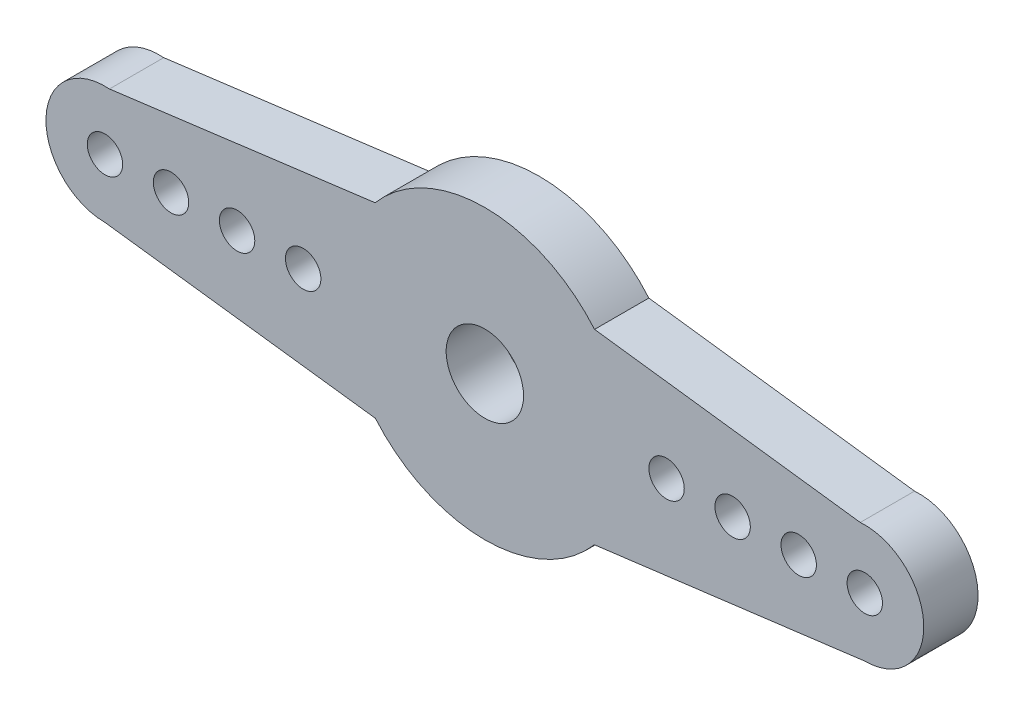
ISO-10303-21;
HEADER;
FILE_DESCRIPTION(('STEP AP214'),'2;1');
FILE_NAME('part.step','',(''),(''),'','','');
FILE_SCHEMA(('AUTOMOTIVE_DESIGN { 1 0 10303 214 1 1 1 1 }'));
ENDSEC;
DATA;
#1=APPLICATION_CONTEXT('core data for automotive mechanical design processes');
#2=APPLICATION_PROTOCOL_DEFINITION('international standard','automotive_design',2000,#1);
#3=PRODUCT_CONTEXT('',#1,'mechanical');
#4=PRODUCT('Part','Part','',(#3));
#5=PRODUCT_RELATED_PRODUCT_CATEGORY('part','',(#4));
#6=PRODUCT_DEFINITION_FORMATION('','',#4);
#7=PRODUCT_DEFINITION_CONTEXT('part definition',#1,'design');
#8=PRODUCT_DEFINITION('design','',#6,#7);
#9=PRODUCT_DEFINITION_SHAPE('','',#8);
#10=(LENGTH_UNIT() NAMED_UNIT(*) SI_UNIT(.MILLI.,.METRE.));
#11=(NAMED_UNIT(*) PLANE_ANGLE_UNIT() SI_UNIT($,.RADIAN.));
#12=(NAMED_UNIT(*) SI_UNIT($,.STERADIAN.) SOLID_ANGLE_UNIT());
#13=UNCERTAINTY_MEASURE_WITH_UNIT(LENGTH_MEASURE(1.E-05),#10,'distance_accuracy_value','');
#14=(GEOMETRIC_REPRESENTATION_CONTEXT(3) GLOBAL_UNCERTAINTY_ASSIGNED_CONTEXT((#13)) GLOBAL_UNIT_ASSIGNED_CONTEXT((#10,
#11,#12)) REPRESENTATION_CONTEXT('',''));
#15=CARTESIAN_POINT('',(0.,0.,0.));
#16=DIRECTION('',(0.,0.,1.));
#17=DIRECTION('',(1.,0.,0.));
#18=AXIS2_PLACEMENT_3D('',#15,#16,#17);
#19=CARTESIAN_POINT('',(0.,0.,2.3));
#20=DIRECTION('',(0.,0.,-1.));
#21=DIRECTION('',(-1.,0.,0.));
#22=AXIS2_PLACEMENT_3D('',#19,#20,#21);
#23=CYLINDRICAL_SURFACE('',#22,6.1);
#24=CARTESIAN_POINT('',(0.,0.,0.));
#25=DIRECTION('',(0.,0.,1.));
#26=DIRECTION('',(1.,0.,0.));
#27=AXIS2_PLACEMENT_3D('',#24,#25,#26);
#28=CIRCLE('',#27,6.1);
#29=CARTESIAN_POINT('',(-4.64050892734946,-3.95925206259844,0.));
#30=VERTEX_POINT('',#29);
#31=CARTESIAN_POINT('',(4.64050892734946,-3.95925206259844,0.));
#32=VERTEX_POINT('',#31);
#33=EDGE_CURVE('E158',#30,#32,#28,.T.);
#34=ORIENTED_EDGE('',*,*,#33,.T.);
#35=DIRECTION('',(0.,0.,-1.));
#36=VECTOR('',#35,1.);
#37=CARTESIAN_POINT('',(4.64050892734946,-3.95925206259844,2.3));
#38=LINE('',#37,#36);
#39=CARTESIAN_POINT('',(4.64050892734946,-3.95925206259844,2.3));
#40=VERTEX_POINT('',#39);
#41=EDGE_CURVE('E11',#40,#32,#38,.T.);
#42=ORIENTED_EDGE('',*,*,#41,.F.);
#43=CARTESIAN_POINT('',(0.,0.,2.3));
#44=DIRECTION('',(0.,0.,1.));
#45=DIRECTION('',(1.,0.,0.));
#46=AXIS2_PLACEMENT_3D('',#43,#44,#45);
#47=CIRCLE('',#46,6.1);
#48=CARTESIAN_POINT('',(-4.64050892734946,-3.95925206259844,2.3));
#49=VERTEX_POINT('',#48);
#50=EDGE_CURVE('E203',#49,#40,#47,.T.);
#51=ORIENTED_EDGE('',*,*,#50,.F.);
#52=DIRECTION('',(0.,0.,-1.));
#53=VECTOR('',#52,1.);
#54=CARTESIAN_POINT('',(-4.64050892734946,-3.95925206259844,2.3));
#55=LINE('',#54,#53);
#56=EDGE_CURVE('E48',#49,#30,#55,.T.);
#57=ORIENTED_EDGE('',*,*,#56,.T.);
#58=EDGE_LOOP('',(#34,#42,#51,#57));
#59=FACE_BOUND('',#58,.T.);
#60=ADVANCED_FACE('F32',(#59),#23,.T.);
#61=CARTESIAN_POINT('',(0.569988751723824,-4.47743906224629,2.3));
#62=DIRECTION('',(-0.126283248481219,0.991994224354674,0.));
#63=DIRECTION('',(-0.991994224354674,-0.126283248481219,0.));
#64=AXIS2_PLACEMENT_3D('',#61,#62,#63);
#65=PLANE('',#64);
#66=DIRECTION('',(0.991994224354674,0.126283248481219,0.));
#67=VECTOR('',#66,1.);
#68=CARTESIAN_POINT('',(0.569988751723824,-4.47743906224629,0.));
#69=LINE('',#68,#67);
#70=CARTESIAN_POINT('',(16.1,-2.50043131236952,0.));
#71=VERTEX_POINT('',#70);
#72=EDGE_CURVE('E160',#32,#71,#69,.T.);
#73=ORIENTED_EDGE('',*,*,#72,.T.);
#74=DIRECTION('',(0.,0.,-1.));
#75=VECTOR('',#74,1.);
#76=CARTESIAN_POINT('',(16.1,-2.50043131236952,2.3));
#77=LINE('',#76,#75);
#78=CARTESIAN_POINT('',(16.1,-2.50043131236952,2.3));
#79=VERTEX_POINT('',#78);
#80=EDGE_CURVE('E40',#79,#71,#77,.T.);
#81=ORIENTED_EDGE('',*,*,#80,.F.);
#82=DIRECTION('',(0.991994224354674,0.126283248481219,0.));
#83=VECTOR('',#82,1.);
#84=CARTESIAN_POINT('',(0.569988751723824,-4.47743906224629,2.3));
#85=LINE('',#84,#83);
#86=EDGE_CURVE('E86',#40,#79,#85,.T.);
#87=ORIENTED_EDGE('',*,*,#86,.F.);
#88=ORIENTED_EDGE('',*,*,#41,.T.);
#89=EDGE_LOOP('',(#73,#81,#87,#88));
#90=FACE_BOUND('',#89,.T.);
#91=ADVANCED_FACE('F231',(#90),#65,.F.);
#92=CARTESIAN_POINT('',(16.1,0.,2.3));
#93=DIRECTION('',(0.,0.,-1.));
#94=DIRECTION('',(-1.,0.,0.));
#95=AXIS2_PLACEMENT_3D('',#92,#93,#94);
#96=CYLINDRICAL_SURFACE('',#95,2.50043131236952);
#97=CARTESIAN_POINT('',(16.1,0.,0.));
#98=DIRECTION('',(0.,0.,1.));
#99=DIRECTION('',(1.,0.,0.));
#100=AXIS2_PLACEMENT_3D('',#97,#98,#99);
#101=CIRCLE('',#100,2.50043131236952);
#102=CARTESIAN_POINT('',(15.9091604900332,2.49313798842215,0.));
#103=VERTEX_POINT('',#102);
#104=EDGE_CURVE('E162',#71,#103,#101,.T.);
#105=ORIENTED_EDGE('',*,*,#104,.T.);
#106=DIRECTION('',(0.,0.,-1.));
#107=VECTOR('',#106,1.);
#108=CARTESIAN_POINT('',(15.9091604900332,2.49313798842215,2.3));
#109=LINE('',#108,#107);
#110=CARTESIAN_POINT('',(15.9091604900332,2.49313798842215,2.3));
#111=VERTEX_POINT('',#110);
#112=EDGE_CURVE('E209',#111,#103,#109,.T.);
#113=ORIENTED_EDGE('',*,*,#112,.F.);
#114=CARTESIAN_POINT('',(16.1,0.,2.3));
#115=DIRECTION('',(0.,0.,1.));
#116=DIRECTION('',(1.,0.,0.));
#117=AXIS2_PLACEMENT_3D('',#114,#115,#116);
#118=CIRCLE('',#117,2.50043131236952);
#119=EDGE_CURVE('E216',#79,#111,#118,.T.);
#120=ORIENTED_EDGE('',*,*,#119,.F.);
#121=ORIENTED_EDGE('',*,*,#80,.T.);
#122=EDGE_LOOP('',(#105,#113,#120,#121));
#123=FACE_BOUND('',#122,.T.);
#124=ADVANCED_FACE('F214',(#123),#96,.T.);
#125=CARTESIAN_POINT('',(0.578588643787063,4.47519548706033,2.3));
#126=DIRECTION('',(0.128220717103098,0.991745656761635,0.));
#127=DIRECTION('',(-0.991745656761635,0.128220717103098,0.));
#128=AXIS2_PLACEMENT_3D('',#125,#126,#127);
#129=PLANE('',#128);
#130=DIRECTION('',(0.991745656761635,-0.128220717103098,0.));
#131=VECTOR('',#130,1.);
#132=CARTESIAN_POINT('',(0.578588643787063,4.47519548706033,0.));
#133=LINE('',#132,#131);
#134=CARTESIAN_POINT('',(4.64932228794987,3.94889886712392,0.));
#135=VERTEX_POINT('',#134);
#136=EDGE_CURVE('E165',#135,#103,#133,.T.);
#137=ORIENTED_EDGE('',*,*,#136,.F.);
#138=DIRECTION('',(0.,0.,-1.));
#139=VECTOR('',#138,1.);
#140=CARTESIAN_POINT('',(4.64932228794987,3.94889886712392,2.3));
#141=LINE('',#140,#139);
#142=CARTESIAN_POINT('',(4.64932228794987,3.94889886712392,2.3));
#143=VERTEX_POINT('',#142);
#144=EDGE_CURVE('E207',#143,#135,#141,.T.);
#145=ORIENTED_EDGE('',*,*,#144,.F.);
#146=DIRECTION('',(0.991745656761635,-0.128220717103098,0.));
#147=VECTOR('',#146,1.);
#148=CARTESIAN_POINT('',(0.578588643787063,4.47519548706033,2.3));
#149=LINE('',#148,#147);
#150=EDGE_CURVE('E225',#143,#111,#149,.T.);
#151=ORIENTED_EDGE('',*,*,#150,.T.);
#152=ORIENTED_EDGE('',*,*,#112,.T.);
#153=EDGE_LOOP('',(#137,#145,#151,#152));
#154=FACE_BOUND('',#153,.T.);
#155=ADVANCED_FACE('F223',(#154),#129,.T.);
#156=CARTESIAN_POINT('',(0.,0.,2.3));
#157=DIRECTION('',(0.,0.,-1.));
#158=DIRECTION('',(-1.,0.,0.));
#159=AXIS2_PLACEMENT_3D('',#156,#157,#158);
#160=CYLINDRICAL_SURFACE('',#159,6.1);
#161=CARTESIAN_POINT('',(0.,0.,0.));
#162=DIRECTION('',(0.,0.,1.));
#163=DIRECTION('',(1.,0.,0.));
#164=AXIS2_PLACEMENT_3D('',#161,#162,#163);
#165=CIRCLE('',#164,6.1);
#166=CARTESIAN_POINT('',(-4.64932228794987,3.94889886712392,0.));
#167=VERTEX_POINT('',#166);
#168=EDGE_CURVE('E168',#135,#167,#165,.T.);
#169=ORIENTED_EDGE('',*,*,#168,.T.);
#170=DIRECTION('',(0.,0.,-1.));
#171=VECTOR('',#170,1.);
#172=CARTESIAN_POINT('',(-4.64932228794987,3.94889886712392,2.3));
#173=LINE('',#172,#171);
#174=CARTESIAN_POINT('',(-4.64932228794987,3.94889886712392,2.3));
#175=VERTEX_POINT('',#174);
#176=EDGE_CURVE('E123',#175,#167,#173,.T.);
#177=ORIENTED_EDGE('',*,*,#176,.F.);
#178=CARTESIAN_POINT('',(0.,0.,2.3));
#179=DIRECTION('',(0.,0.,1.));
#180=DIRECTION('',(1.,0.,0.));
#181=AXIS2_PLACEMENT_3D('',#178,#179,#180);
#182=CIRCLE('',#181,6.1);
#183=EDGE_CURVE('E111',#143,#175,#182,.T.);
#184=ORIENTED_EDGE('',*,*,#183,.F.);
#185=ORIENTED_EDGE('',*,*,#144,.T.);
#186=EDGE_LOOP('',(#169,#177,#184,#185));
#187=FACE_BOUND('',#186,.T.);
#188=ADVANCED_FACE('F241',(#187),#160,.T.);
#189=CARTESIAN_POINT('',(-0.578588643787063,4.47519548706033,2.3));
#190=DIRECTION('',(0.128220717103098,-0.991745656761635,0.));
#191=DIRECTION('',(0.991745656761635,0.128220717103098,0.));
#192=AXIS2_PLACEMENT_3D('',#189,#190,#191);
#193=PLANE('',#192);
#194=DIRECTION('',(-0.991745656761635,-0.128220717103098,0.));
#195=VECTOR('',#194,1.);
#196=CARTESIAN_POINT('',(-0.578588643787063,4.47519548706033,0.));
#197=LINE('',#196,#195);
#198=CARTESIAN_POINT('',(-15.9091604900332,2.49313798842215,0.));
#199=VERTEX_POINT('',#198);
#200=EDGE_CURVE('E120',#167,#199,#197,.T.);
#201=ORIENTED_EDGE('',*,*,#200,.T.);
#202=DIRECTION('',(0.,0.,-1.));
#203=VECTOR('',#202,1.);
#204=CARTESIAN_POINT('',(-15.9091604900332,2.49313798842215,2.3));
#205=LINE('',#204,#203);
#206=CARTESIAN_POINT('',(-15.9091604900332,2.49313798842215,2.3));
#207=VERTEX_POINT('',#206);
#208=EDGE_CURVE('E117',#207,#199,#205,.T.);
#209=ORIENTED_EDGE('',*,*,#208,.F.);
#210=DIRECTION('',(-0.991745656761635,-0.128220717103098,0.));
#211=VECTOR('',#210,1.);
#212=CARTESIAN_POINT('',(-0.578588643787063,4.47519548706033,2.3));
#213=LINE('',#212,#211);
#214=EDGE_CURVE('E102',#175,#207,#213,.T.);
#215=ORIENTED_EDGE('',*,*,#214,.F.);
#216=ORIENTED_EDGE('',*,*,#176,.T.);
#217=EDGE_LOOP('',(#201,#209,#215,#216));
#218=FACE_BOUND('',#217,.T.);
#219=ADVANCED_FACE('F118',(#218),#193,.F.);
#220=CARTESIAN_POINT('',(-16.1,0.,2.3));
#221=DIRECTION('',(0.,0.,-1.));
#222=DIRECTION('',(-1.,0.,0.));
#223=AXIS2_PLACEMENT_3D('',#220,#221,#222);
#224=CYLINDRICAL_SURFACE('',#223,2.50043131236952);
#225=CARTESIAN_POINT('',(-16.1,0.,0.));
#226=DIRECTION('',(0.,0.,1.));
#227=DIRECTION('',(1.,0.,0.));
#228=AXIS2_PLACEMENT_3D('',#225,#226,#227);
#229=CIRCLE('',#228,2.50043131236952);
#230=CARTESIAN_POINT('',(-16.1,-2.50043131236952,0.));
#231=VERTEX_POINT('',#230);
#232=EDGE_CURVE('E171',#231,#199,#229,.F.);
#233=ORIENTED_EDGE('',*,*,#232,.F.);
#234=DIRECTION('',(0.,0.,-1.));
#235=VECTOR('',#234,1.);
#236=CARTESIAN_POINT('',(-16.1,-2.50043131236952,2.3));
#237=LINE('',#236,#235);
#238=CARTESIAN_POINT('',(-16.1,-2.50043131236952,2.3));
#239=VERTEX_POINT('',#238);
#240=EDGE_CURVE('E74',#239,#231,#237,.T.);
#241=ORIENTED_EDGE('',*,*,#240,.F.);
#242=CARTESIAN_POINT('',(-16.1,0.,2.3));
#243=DIRECTION('',(0.,0.,1.));
#244=DIRECTION('',(1.,0.,0.));
#245=AXIS2_PLACEMENT_3D('',#242,#243,#244);
#246=CIRCLE('',#245,2.50043131236952);
#247=EDGE_CURVE('E108',#239,#207,#246,.F.);
#248=ORIENTED_EDGE('',*,*,#247,.T.);
#249=ORIENTED_EDGE('',*,*,#208,.T.);
#250=EDGE_LOOP('',(#233,#241,#248,#249));
#251=FACE_BOUND('',#250,.T.);
#252=ADVANCED_FACE('F125',(#251),#224,.T.);
#253=CARTESIAN_POINT('',(16.1,0.,2.3));
#254=DIRECTION('',(0.,0.,-1.));
#255=DIRECTION('',(-1.,0.,0.));
#256=AXIS2_PLACEMENT_3D('',#253,#254,#255);
#257=CYLINDRICAL_SURFACE('',#256,0.750000000000002);
#258=CARTESIAN_POINT('',(16.1,0.,2.3));
#259=DIRECTION('',(0.,0.,1.));
#260=DIRECTION('',(1.,0.,0.));
#261=AXIS2_PLACEMENT_3D('',#258,#259,#260);
#262=CIRCLE('',#261,0.750000000000002);
#263=CARTESIAN_POINT('',(16.85,0.,2.3));
#264=VERTEX_POINT('',#263);
#265=EDGE_CURVE('E152',#264,#264,#262,.T.);
#266=ORIENTED_EDGE('',*,*,#265,.T.);
#267=EDGE_LOOP('',(#266));
#268=FACE_BOUND('',#267,.T.);
#269=CARTESIAN_POINT('',(16.1,0.,0.));
#270=DIRECTION('',(0.,0.,1.));
#271=DIRECTION('',(1.,0.,0.));
#272=AXIS2_PLACEMENT_3D('',#269,#270,#271);
#273=CIRCLE('',#272,0.750000000000002);
#274=CARTESIAN_POINT('',(16.85,0.,0.));
#275=VERTEX_POINT('',#274);
#276=EDGE_CURVE('E197',#275,#275,#273,.T.);
#277=ORIENTED_EDGE('',*,*,#276,.F.);
#278=EDGE_LOOP('',(#277));
#279=FACE_BOUND('',#278,.T.);
#280=ADVANCED_FACE('F249',(#268,#279),#257,.F.);
#281=CARTESIAN_POINT('',(13.3,0.,2.3));
#282=DIRECTION('',(0.,0.,-1.));
#283=DIRECTION('',(-1.,0.,0.));
#284=AXIS2_PLACEMENT_3D('',#281,#282,#283);
#285=CYLINDRICAL_SURFACE('',#284,0.75);
#286=CARTESIAN_POINT('',(13.3,0.,2.3));
#287=DIRECTION('',(0.,0.,1.));
#288=DIRECTION('',(1.,0.,0.));
#289=AXIS2_PLACEMENT_3D('',#286,#287,#288);
#290=CIRCLE('',#289,0.75);
#291=CARTESIAN_POINT('',(14.05,0.,2.3));
#292=VERTEX_POINT('',#291);
#293=EDGE_CURVE('E149',#292,#292,#290,.T.);
#294=ORIENTED_EDGE('',*,*,#293,.T.);
#295=EDGE_LOOP('',(#294));
#296=FACE_BOUND('',#295,.T.);
#297=CARTESIAN_POINT('',(13.3,0.,0.));
#298=DIRECTION('',(0.,0.,1.));
#299=DIRECTION('',(1.,0.,0.));
#300=AXIS2_PLACEMENT_3D('',#297,#298,#299);
#301=CIRCLE('',#300,0.75);
#302=CARTESIAN_POINT('',(14.05,0.,0.));
#303=VERTEX_POINT('',#302);
#304=EDGE_CURVE('E194',#303,#303,#301,.T.);
#305=ORIENTED_EDGE('',*,*,#304,.F.);
#306=EDGE_LOOP('',(#305));
#307=FACE_BOUND('',#306,.T.);
#308=ADVANCED_FACE('F277',(#296,#307),#285,.F.);
#309=CARTESIAN_POINT('',(10.5,0.,2.3));
#310=DIRECTION('',(0.,0.,-1.));
#311=DIRECTION('',(-1.,0.,0.));
#312=AXIS2_PLACEMENT_3D('',#309,#310,#311);
#313=CYLINDRICAL_SURFACE('',#312,0.75);
#314=CARTESIAN_POINT('',(10.5,0.,2.3));
#315=DIRECTION('',(0.,0.,1.));
#316=DIRECTION('',(1.,0.,0.));
#317=AXIS2_PLACEMENT_3D('',#314,#315,#316);
#318=CIRCLE('',#317,0.75);
#319=CARTESIAN_POINT('',(11.25,0.,2.3));
#320=VERTEX_POINT('',#319);
#321=EDGE_CURVE('E146',#320,#320,#318,.T.);
#322=ORIENTED_EDGE('',*,*,#321,.T.);
#323=EDGE_LOOP('',(#322));
#324=FACE_BOUND('',#323,.T.);
#325=CARTESIAN_POINT('',(10.5,0.,0.));
#326=DIRECTION('',(0.,0.,1.));
#327=DIRECTION('',(1.,0.,0.));
#328=AXIS2_PLACEMENT_3D('',#325,#326,#327);
#329=CIRCLE('',#328,0.75);
#330=CARTESIAN_POINT('',(11.25,0.,0.));
#331=VERTEX_POINT('',#330);
#332=EDGE_CURVE('E191',#331,#331,#329,.T.);
#333=ORIENTED_EDGE('',*,*,#332,.F.);
#334=EDGE_LOOP('',(#333));
#335=FACE_BOUND('',#334,.T.);
#336=ADVANCED_FACE('F273',(#324,#335),#313,.F.);
#337=CARTESIAN_POINT('',(-16.1,0.,2.3));
#338=DIRECTION('',(0.,0.,-1.));
#339=DIRECTION('',(-1.,0.,0.));
#340=AXIS2_PLACEMENT_3D('',#337,#338,#339);
#341=CYLINDRICAL_SURFACE('',#340,0.750000000000002);
#342=CARTESIAN_POINT('',(-16.1,0.,2.3));
#343=DIRECTION('',(0.,0.,1.));
#344=DIRECTION('',(1.,0.,0.));
#345=AXIS2_PLACEMENT_3D('',#342,#343,#344);
#346=CIRCLE('',#345,0.750000000000002);
#347=CARTESIAN_POINT('',(-15.35,0.,2.3));
#348=VERTEX_POINT('',#347);
#349=EDGE_CURVE('E143',#348,#348,#346,.F.);
#350=ORIENTED_EDGE('',*,*,#349,.F.);
#351=EDGE_LOOP('',(#350));
#352=FACE_BOUND('',#351,.T.);
#353=CARTESIAN_POINT('',(-16.1,0.,0.));
#354=DIRECTION('',(0.,0.,1.));
#355=DIRECTION('',(1.,0.,0.));
#356=AXIS2_PLACEMENT_3D('',#353,#354,#355);
#357=CIRCLE('',#356,0.750000000000002);
#358=CARTESIAN_POINT('',(-15.35,0.,0.));
#359=VERTEX_POINT('',#358);
#360=EDGE_CURVE('E188',#359,#359,#357,.F.);
#361=ORIENTED_EDGE('',*,*,#360,.T.);
#362=EDGE_LOOP('',(#361));
#363=FACE_BOUND('',#362,.T.);
#364=ADVANCED_FACE('F269',(#352,#363),#341,.F.);
#365=CARTESIAN_POINT('',(-13.3,0.,2.3));
#366=DIRECTION('',(0.,0.,-1.));
#367=DIRECTION('',(-1.,0.,0.));
#368=AXIS2_PLACEMENT_3D('',#365,#366,#367);
#369=CYLINDRICAL_SURFACE('',#368,0.75);
#370=CARTESIAN_POINT('',(-13.3,0.,2.3));
#371=DIRECTION('',(0.,0.,1.));
#372=DIRECTION('',(1.,0.,0.));
#373=AXIS2_PLACEMENT_3D('',#370,#371,#372);
#374=CIRCLE('',#373,0.75);
#375=CARTESIAN_POINT('',(-12.55,0.,2.3));
#376=VERTEX_POINT('',#375);
#377=EDGE_CURVE('E140',#376,#376,#374,.F.);
#378=ORIENTED_EDGE('',*,*,#377,.F.);
#379=EDGE_LOOP('',(#378));
#380=FACE_BOUND('',#379,.T.);
#381=CARTESIAN_POINT('',(-13.3,0.,0.));
#382=DIRECTION('',(0.,0.,1.));
#383=DIRECTION('',(1.,0.,0.));
#384=AXIS2_PLACEMENT_3D('',#381,#382,#383);
#385=CIRCLE('',#384,0.75);
#386=CARTESIAN_POINT('',(-12.55,0.,0.));
#387=VERTEX_POINT('',#386);
#388=EDGE_CURVE('E185',#387,#387,#385,.F.);
#389=ORIENTED_EDGE('',*,*,#388,.T.);
#390=EDGE_LOOP('',(#389));
#391=FACE_BOUND('',#390,.T.);
#392=ADVANCED_FACE('F265',(#380,#391),#369,.F.);
#393=CARTESIAN_POINT('',(-10.5,0.,2.3));
#394=DIRECTION('',(0.,0.,-1.));
#395=DIRECTION('',(-1.,0.,0.));
#396=AXIS2_PLACEMENT_3D('',#393,#394,#395);
#397=CYLINDRICAL_SURFACE('',#396,0.75);
#398=CARTESIAN_POINT('',(-10.5,0.,2.3));
#399=DIRECTION('',(0.,0.,1.));
#400=DIRECTION('',(1.,0.,0.));
#401=AXIS2_PLACEMENT_3D('',#398,#399,#400);
#402=CIRCLE('',#401,0.75);
#403=CARTESIAN_POINT('',(-9.75,0.,2.3));
#404=VERTEX_POINT('',#403);
#405=EDGE_CURVE('E137',#404,#404,#402,.F.);
#406=ORIENTED_EDGE('',*,*,#405,.F.);
#407=EDGE_LOOP('',(#406));
#408=FACE_BOUND('',#407,.T.);
#409=CARTESIAN_POINT('',(-10.5,0.,0.));
#410=DIRECTION('',(0.,0.,1.));
#411=DIRECTION('',(1.,0.,0.));
#412=AXIS2_PLACEMENT_3D('',#409,#410,#411);
#413=CIRCLE('',#412,0.75);
#414=CARTESIAN_POINT('',(-9.75,0.,0.));
#415=VERTEX_POINT('',#414);
#416=EDGE_CURVE('E182',#415,#415,#413,.F.);
#417=ORIENTED_EDGE('',*,*,#416,.T.);
#418=EDGE_LOOP('',(#417));
#419=FACE_BOUND('',#418,.T.);
#420=ADVANCED_FACE('F261',(#408,#419),#397,.F.);
#421=CARTESIAN_POINT('',(-7.7,0.,2.3));
#422=DIRECTION('',(0.,0.,-1.));
#423=DIRECTION('',(-1.,0.,0.));
#424=AXIS2_PLACEMENT_3D('',#421,#422,#423);
#425=CYLINDRICAL_SURFACE('',#424,0.75);
#426=CARTESIAN_POINT('',(-7.7,0.,2.3));
#427=DIRECTION('',(0.,0.,1.));
#428=DIRECTION('',(1.,0.,0.));
#429=AXIS2_PLACEMENT_3D('',#426,#427,#428);
#430=CIRCLE('',#429,0.75);
#431=CARTESIAN_POINT('',(-6.95,0.,2.3));
#432=VERTEX_POINT('',#431);
#433=EDGE_CURVE('E134',#432,#432,#430,.F.);
#434=ORIENTED_EDGE('',*,*,#433,.F.);
#435=EDGE_LOOP('',(#434));
#436=FACE_BOUND('',#435,.T.);
#437=CARTESIAN_POINT('',(-7.7,0.,0.));
#438=DIRECTION('',(0.,0.,1.));
#439=DIRECTION('',(1.,0.,0.));
#440=AXIS2_PLACEMENT_3D('',#437,#438,#439);
#441=CIRCLE('',#440,0.75);
#442=CARTESIAN_POINT('',(-6.95,0.,0.));
#443=VERTEX_POINT('',#442);
#444=EDGE_CURVE('E179',#443,#443,#441,.F.);
#445=ORIENTED_EDGE('',*,*,#444,.T.);
#446=EDGE_LOOP('',(#445));
#447=FACE_BOUND('',#446,.T.);
#448=ADVANCED_FACE('F257',(#436,#447),#425,.F.);
#449=CARTESIAN_POINT('',(0.,0.,2.3));
#450=DIRECTION('',(0.,0.,-1.));
#451=DIRECTION('',(-1.,0.,0.));
#452=AXIS2_PLACEMENT_3D('',#449,#450,#451);
#453=CYLINDRICAL_SURFACE('',#452,1.64);
#454=CARTESIAN_POINT('',(0.,0.,2.3));
#455=DIRECTION('',(0.,0.,1.));
#456=DIRECTION('',(1.,0.,0.));
#457=AXIS2_PLACEMENT_3D('',#454,#455,#456);
#458=CIRCLE('',#457,1.64);
#459=CARTESIAN_POINT('',(1.64,0.,2.3));
#460=VERTEX_POINT('',#459);
#461=EDGE_CURVE('E128',#460,#460,#458,.T.);
#462=ORIENTED_EDGE('',*,*,#461,.T.);
#463=EDGE_LOOP('',(#462));
#464=FACE_BOUND('',#463,.T.);
#465=CARTESIAN_POINT('',(0.,0.,0.));
#466=DIRECTION('',(0.,0.,1.));
#467=DIRECTION('',(1.,0.,0.));
#468=AXIS2_PLACEMENT_3D('',#465,#466,#467);
#469=CIRCLE('',#468,1.64);
#470=CARTESIAN_POINT('',(1.64,0.,0.));
#471=VERTEX_POINT('',#470);
#472=EDGE_CURVE('E176',#471,#471,#469,.T.);
#473=ORIENTED_EDGE('',*,*,#472,.F.);
#474=EDGE_LOOP('',(#473));
#475=FACE_BOUND('',#474,.T.);
#476=ADVANCED_FACE('F254',(#464,#475),#453,.F.);
#477=CARTESIAN_POINT('',(-0.569988751723824,-4.47743906224629,2.3));
#478=DIRECTION('',(-0.126283248481219,-0.991994224354674,0.));
#479=DIRECTION('',(0.991994224354674,-0.126283248481219,0.));
#480=AXIS2_PLACEMENT_3D('',#477,#478,#479);
#481=PLANE('',#480);
#482=DIRECTION('',(-0.991994224354674,0.126283248481219,0.));
#483=VECTOR('',#482,1.);
#484=CARTESIAN_POINT('',(-0.569988751723824,-4.47743906224629,0.));
#485=LINE('',#484,#483);
#486=EDGE_CURVE('E173',#30,#231,#485,.T.);
#487=ORIENTED_EDGE('',*,*,#486,.F.);
#488=ORIENTED_EDGE('',*,*,#56,.F.);
#489=DIRECTION('',(-0.991994224354674,0.126283248481219,0.));
#490=VECTOR('',#489,1.);
#491=CARTESIAN_POINT('',(-0.569988751723824,-4.47743906224629,2.3));
#492=LINE('',#491,#490);
#493=EDGE_CURVE('E126',#49,#239,#492,.T.);
#494=ORIENTED_EDGE('',*,*,#493,.T.);
#495=ORIENTED_EDGE('',*,*,#240,.T.);
#496=EDGE_LOOP('',(#487,#488,#494,#495));
#497=FACE_BOUND('',#496,.T.);
#498=ADVANCED_FACE('F250',(#497),#481,.T.);
#499=CARTESIAN_POINT('',(7.7,0.,2.3));
#500=DIRECTION('',(0.,0.,-1.));
#501=DIRECTION('',(-1.,0.,0.));
#502=AXIS2_PLACEMENT_3D('',#499,#500,#501);
#503=CYLINDRICAL_SURFACE('',#502,0.75);
#504=CARTESIAN_POINT('',(7.7,0.,2.3));
#505=DIRECTION('',(0.,0.,1.));
#506=DIRECTION('',(1.,0.,0.));
#507=AXIS2_PLACEMENT_3D('',#504,#505,#506);
#508=CIRCLE('',#507,0.75);
#509=CARTESIAN_POINT('',(8.45,0.,2.3));
#510=VERTEX_POINT('',#509);
#511=EDGE_CURVE('E155',#510,#510,#508,.T.);
#512=ORIENTED_EDGE('',*,*,#511,.T.);
#513=EDGE_LOOP('',(#512));
#514=FACE_BOUND('',#513,.T.);
#515=CARTESIAN_POINT('',(7.7,0.,0.));
#516=DIRECTION('',(0.,0.,1.));
#517=DIRECTION('',(1.,0.,0.));
#518=AXIS2_PLACEMENT_3D('',#515,#516,#517);
#519=CIRCLE('',#518,0.75);
#520=CARTESIAN_POINT('',(8.45,0.,0.));
#521=VERTEX_POINT('',#520);
#522=EDGE_CURVE('E200',#521,#521,#519,.T.);
#523=ORIENTED_EDGE('',*,*,#522,.F.);
#524=EDGE_LOOP('',(#523));
#525=FACE_BOUND('',#524,.T.);
#526=ADVANCED_FACE('F253',(#514,#525),#503,.F.);
#527=CARTESIAN_POINT('',(0.,0.,2.3));
#528=DIRECTION('',(0.,0.,1.));
#529=DIRECTION('',(1.,0.,0.));
#530=AXIS2_PLACEMENT_3D('',#527,#528,#529);
#531=PLANE('',#530);
#532=ORIENTED_EDGE('',*,*,#50,.T.);
#533=ORIENTED_EDGE('',*,*,#86,.T.);
#534=ORIENTED_EDGE('',*,*,#119,.T.);
#535=ORIENTED_EDGE('',*,*,#150,.F.);
#536=ORIENTED_EDGE('',*,*,#183,.T.);
#537=ORIENTED_EDGE('',*,*,#214,.T.);
#538=ORIENTED_EDGE('',*,*,#247,.F.);
#539=ORIENTED_EDGE('',*,*,#493,.F.);
#540=EDGE_LOOP('',(#532,#533,#534,#535,#536,#537,#538,#539));
#541=FACE_BOUND('',#540,.T.);
#542=ORIENTED_EDGE('',*,*,#461,.F.);
#543=EDGE_LOOP('',(#542));
#544=FACE_BOUND('',#543,.T.);
#545=ORIENTED_EDGE('',*,*,#433,.T.);
#546=EDGE_LOOP('',(#545));
#547=FACE_BOUND('',#546,.T.);
#548=ORIENTED_EDGE('',*,*,#405,.T.);
#549=EDGE_LOOP('',(#548));
#550=FACE_BOUND('',#549,.T.);
#551=ORIENTED_EDGE('',*,*,#377,.T.);
#552=EDGE_LOOP('',(#551));
#553=FACE_BOUND('',#552,.T.);
#554=ORIENTED_EDGE('',*,*,#349,.T.);
#555=EDGE_LOOP('',(#554));
#556=FACE_BOUND('',#555,.T.);
#557=ORIENTED_EDGE('',*,*,#321,.F.);
#558=EDGE_LOOP('',(#557));
#559=FACE_BOUND('',#558,.T.);
#560=ORIENTED_EDGE('',*,*,#293,.F.);
#561=EDGE_LOOP('',(#560));
#562=FACE_BOUND('',#561,.T.);
#563=ORIENTED_EDGE('',*,*,#265,.F.);
#564=EDGE_LOOP('',(#563));
#565=FACE_BOUND('',#564,.T.);
#566=ORIENTED_EDGE('',*,*,#511,.F.);
#567=EDGE_LOOP('',(#566));
#568=FACE_BOUND('',#567,.T.);
#569=ADVANCED_FACE('F104',(#541,#544,#547,#550,#553,#556,#559,#562,#565,#568),#531,.T.);
#570=CARTESIAN_POINT('',(0.,0.,0.));
#571=DIRECTION('',(0.,0.,1.));
#572=DIRECTION('',(1.,0.,0.));
#573=AXIS2_PLACEMENT_3D('',#570,#571,#572);
#574=PLANE('',#573);
#575=ORIENTED_EDGE('',*,*,#33,.F.);
#576=ORIENTED_EDGE('',*,*,#486,.T.);
#577=ORIENTED_EDGE('',*,*,#232,.T.);
#578=ORIENTED_EDGE('',*,*,#200,.F.);
#579=ORIENTED_EDGE('',*,*,#168,.F.);
#580=ORIENTED_EDGE('',*,*,#136,.T.);
#581=ORIENTED_EDGE('',*,*,#104,.F.);
#582=ORIENTED_EDGE('',*,*,#72,.F.);
#583=EDGE_LOOP('',(#575,#576,#577,#578,#579,#580,#581,#582));
#584=FACE_BOUND('',#583,.T.);
#585=ORIENTED_EDGE('',*,*,#472,.T.);
#586=EDGE_LOOP('',(#585));
#587=FACE_BOUND('',#586,.T.);
#588=ORIENTED_EDGE('',*,*,#444,.F.);
#589=EDGE_LOOP('',(#588));
#590=FACE_BOUND('',#589,.T.);
#591=ORIENTED_EDGE('',*,*,#416,.F.);
#592=EDGE_LOOP('',(#591));
#593=FACE_BOUND('',#592,.T.);
#594=ORIENTED_EDGE('',*,*,#388,.F.);
#595=EDGE_LOOP('',(#594));
#596=FACE_BOUND('',#595,.T.);
#597=ORIENTED_EDGE('',*,*,#360,.F.);
#598=EDGE_LOOP('',(#597));
#599=FACE_BOUND('',#598,.T.);
#600=ORIENTED_EDGE('',*,*,#332,.T.);
#601=EDGE_LOOP('',(#600));
#602=FACE_BOUND('',#601,.T.);
#603=ORIENTED_EDGE('',*,*,#304,.T.);
#604=EDGE_LOOP('',(#603));
#605=FACE_BOUND('',#604,.T.);
#606=ORIENTED_EDGE('',*,*,#276,.T.);
#607=EDGE_LOOP('',(#606));
#608=FACE_BOUND('',#607,.T.);
#609=ORIENTED_EDGE('',*,*,#522,.T.);
#610=EDGE_LOOP('',(#609));
#611=FACE_BOUND('',#610,.T.);
#612=ADVANCED_FACE('F218',(#584,#587,#590,#593,#596,#599,#602,#605,#608,#611),#574,.F.);
#613=CLOSED_SHELL('',(#60,#91,#124,#155,#188,#219,#252,#280,#308,#336,#364,#392,#420,#448,#476,
#498,#526,#569,#612));
#614=MANIFOLD_SOLID_BREP('B2',#613);
#615=ADVANCED_BREP_SHAPE_REPRESENTATION('',(#18,#614),#14);
#616=SHAPE_DEFINITION_REPRESENTATION(#9,#615);
ENDSEC;
END-ISO-10303-21;
